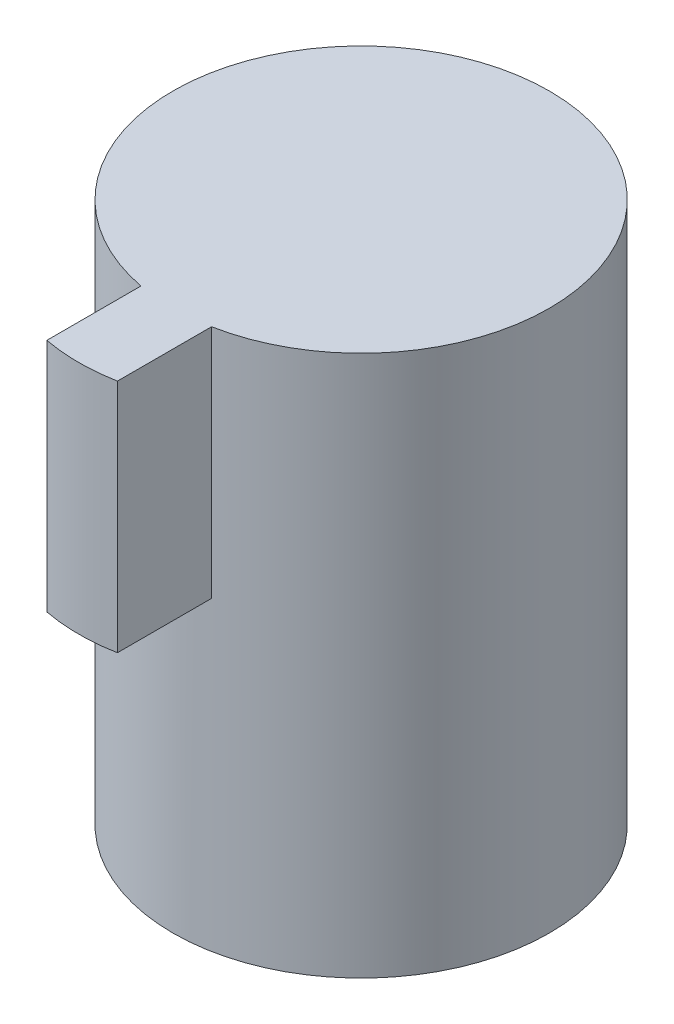
ISO-10303-21;
HEADER;
FILE_DESCRIPTION(('STEP AP214'),'2;1');
FILE_NAME('part.step','',(''),(''),'','','');
FILE_SCHEMA(('AUTOMOTIVE_DESIGN { 1 0 10303 214 1 1 1 1 }'));
ENDSEC;
DATA;
#1=APPLICATION_CONTEXT('core data for automotive mechanical design processes');
#2=APPLICATION_PROTOCOL_DEFINITION('international standard','automotive_design',2000,#1);
#3=PRODUCT_CONTEXT('',#1,'mechanical');
#4=PRODUCT('Part','Part','',(#3));
#5=PRODUCT_RELATED_PRODUCT_CATEGORY('part','',(#4));
#6=PRODUCT_DEFINITION_FORMATION('','',#4);
#7=PRODUCT_DEFINITION_CONTEXT('part definition',#1,'design');
#8=PRODUCT_DEFINITION('design','',#6,#7);
#9=PRODUCT_DEFINITION_SHAPE('','',#8);
#10=(LENGTH_UNIT() NAMED_UNIT(*) SI_UNIT(.MILLI.,.METRE.));
#11=(NAMED_UNIT(*) PLANE_ANGLE_UNIT() SI_UNIT($,.RADIAN.));
#12=(NAMED_UNIT(*) SI_UNIT($,.STERADIAN.) SOLID_ANGLE_UNIT());
#13=UNCERTAINTY_MEASURE_WITH_UNIT(LENGTH_MEASURE(1.E-05),#10,'distance_accuracy_value','');
#14=(GEOMETRIC_REPRESENTATION_CONTEXT(3) GLOBAL_UNCERTAINTY_ASSIGNED_CONTEXT((#13)) GLOBAL_UNIT_ASSIGNED_CONTEXT((#10,
#11,#12)) REPRESENTATION_CONTEXT('',''));
#15=CARTESIAN_POINT('',(0.,0.,0.));
#16=DIRECTION('',(0.,0.,1.));
#17=DIRECTION('',(1.,0.,0.));
#18=AXIS2_PLACEMENT_3D('',#15,#16,#17);
#19=CARTESIAN_POINT('',(0.,11.5,0.));
#20=DIRECTION('',(0.,1.,0.));
#21=DIRECTION('',(-1.,0.,0.));
#22=AXIS2_PLACEMENT_3D('',#19,#20,#21);
#23=PLANE('',#22);
#24=CARTESIAN_POINT('',(0.,11.5,0.));
#25=DIRECTION('',(0.,-1.,0.));
#26=DIRECTION('',(1.,0.,0.));
#27=AXIS2_PLACEMENT_3D('',#24,#25,#26);
#28=CIRCLE('',#27,4.);
#29=CARTESIAN_POINT('',(-0.750000000000001,11.5,3.92905841137543));
#30=VERTEX_POINT('',#29);
#31=CARTESIAN_POINT('',(0.749999999999999,11.5,3.92905841137543));
#32=VERTEX_POINT('',#31);
#33=EDGE_CURVE('E11',#30,#32,#28,.T.);
#34=ORIENTED_EDGE('',*,*,#33,.F.);
#35=DIRECTION('',(0.,0.,1.));
#36=VECTOR('',#35,1.);
#37=CARTESIAN_POINT('',(-0.750000000000001,11.5,3.92905841137543));
#38=LINE('',#37,#36);
#39=CARTESIAN_POINT('',(-0.750000000000001,11.5,5.92905841137543));
#40=VERTEX_POINT('',#39);
#41=EDGE_CURVE('E62',#30,#40,#38,.T.);
#42=ORIENTED_EDGE('',*,*,#41,.T.);
#43=CARTESIAN_POINT('',(0.,11.5,2.));
#44=DIRECTION('',(0.,-1.,0.));
#45=DIRECTION('',(0.,0.,-1.));
#46=AXIS2_PLACEMENT_3D('',#43,#44,#45);
#47=CIRCLE('',#46,4.);
#48=CARTESIAN_POINT('',(0.749999999999999,11.5,5.92905841137543));
#49=VERTEX_POINT('',#48);
#50=EDGE_CURVE('E80',#49,#40,#47,.T.);
#51=ORIENTED_EDGE('',*,*,#50,.F.);
#52=DIRECTION('',(0.,0.,1.));
#53=VECTOR('',#52,1.);
#54=CARTESIAN_POINT('',(0.75,11.5,3.92905841137543));
#55=LINE('',#54,#53);
#56=EDGE_CURVE('E85',#32,#49,#55,.T.);
#57=ORIENTED_EDGE('',*,*,#56,.F.);
#58=EDGE_LOOP('',(#34,#42,#51,#57));
#59=FACE_BOUND('',#58,.T.);
#60=ADVANCED_FACE('F39',(#59),#23,.T.);
#61=CARTESIAN_POINT('',(0.,0.,0.));
#62=DIRECTION('',(0.,-1.,0.));
#63=DIRECTION('',(1.,0.,0.));
#64=AXIS2_PLACEMENT_3D('',#61,#62,#63);
#65=CYLINDRICAL_SURFACE('',#64,4.);
#66=DIRECTION('',(0.,-1.,0.));
#67=VECTOR('',#66,1.);
#68=CARTESIAN_POINT('',(-0.750000000000001,0.,3.92905841137543));
#69=LINE('',#68,#67);
#70=CARTESIAN_POINT('',(-0.750000000000001,6.5,3.92905841137543));
#71=VERTEX_POINT('',#70);
#72=EDGE_CURVE('E100',#30,#71,#69,.T.);
#73=ORIENTED_EDGE('',*,*,#72,.F.);
#74=ORIENTED_EDGE('',*,*,#33,.T.);
#75=DIRECTION('',(0.,-1.,0.));
#76=VECTOR('',#75,1.);
#77=CARTESIAN_POINT('',(0.75,0.,3.92905841137543));
#78=LINE('',#77,#76);
#79=CARTESIAN_POINT('',(0.75,6.5,3.92905841137543));
#80=VERTEX_POINT('',#79);
#81=EDGE_CURVE('E91',#32,#80,#78,.T.);
#82=ORIENTED_EDGE('',*,*,#81,.T.);
#83=CARTESIAN_POINT('',(0.,6.5,0.));
#84=DIRECTION('',(0.,1.,0.));
#85=DIRECTION('',(0.,0.,1.));
#86=AXIS2_PLACEMENT_3D('',#83,#84,#85);
#87=CIRCLE('',#86,4.);
#88=EDGE_CURVE('E53',#71,#80,#87,.T.);
#89=ORIENTED_EDGE('',*,*,#88,.F.);
#90=EDGE_LOOP('',(#73,#74,#82,#89));
#91=FACE_BOUND('',#90,.T.);
#92=CARTESIAN_POINT('',(0.,0.,0.));
#93=DIRECTION('',(0.,-1.,0.));
#94=DIRECTION('',(1.,0.,0.));
#95=AXIS2_PLACEMENT_3D('',#92,#93,#94);
#96=CIRCLE('',#95,4.);
#97=CARTESIAN_POINT('',(4.,0.,0.));
#98=VERTEX_POINT('',#97);
#99=EDGE_CURVE('E46',#98,#98,#96,.T.);
#100=ORIENTED_EDGE('',*,*,#99,.F.);
#101=EDGE_LOOP('',(#100));
#102=FACE_BOUND('',#101,.T.);
#103=ADVANCED_FACE('F98',(#91,#102),#65,.T.);
#104=CARTESIAN_POINT('',(4.,0.,0.));
#105=DIRECTION('',(0.,-1.,0.));
#106=DIRECTION('',(1.,0.,0.));
#107=AXIS2_PLACEMENT_3D('',#104,#105,#106);
#108=PLANE('',#107);
#109=ORIENTED_EDGE('',*,*,#99,.T.);
#110=EDGE_LOOP('',(#109));
#111=FACE_BOUND('',#110,.T.);
#112=CARTESIAN_POINT('',(0.,0.,0.));
#113=DIRECTION('',(0.,-1.,0.));
#114=DIRECTION('',(1.,0.,0.));
#115=AXIS2_PLACEMENT_3D('',#112,#113,#114);
#116=CIRCLE('',#115,2.5);
#117=CARTESIAN_POINT('',(2.5,0.,0.));
#118=VERTEX_POINT('',#117);
#119=EDGE_CURVE('E117',#118,#118,#116,.T.);
#120=ORIENTED_EDGE('',*,*,#119,.F.);
#121=EDGE_LOOP('',(#120));
#122=FACE_BOUND('',#121,.T.);
#123=ADVANCED_FACE('F122',(#111,#122),#108,.T.);
#124=CARTESIAN_POINT('',(0.,0.,0.));
#125=DIRECTION('',(0.,-1.,0.));
#126=DIRECTION('',(1.,0.,0.));
#127=AXIS2_PLACEMENT_3D('',#124,#125,#126);
#128=CYLINDRICAL_SURFACE('',#127,2.5);
#129=ORIENTED_EDGE('',*,*,#119,.T.);
#130=EDGE_LOOP('',(#129));
#131=FACE_BOUND('',#130,.T.);
#132=CARTESIAN_POINT('',(0.,10.,0.));
#133=DIRECTION('',(0.,-1.,0.));
#134=DIRECTION('',(1.,0.,0.));
#135=AXIS2_PLACEMENT_3D('',#132,#133,#134);
#136=CIRCLE('',#135,2.5);
#137=CARTESIAN_POINT('',(2.5,10.,0.));
#138=VERTEX_POINT('',#137);
#139=EDGE_CURVE('E95',#138,#138,#136,.T.);
#140=ORIENTED_EDGE('',*,*,#139,.F.);
#141=EDGE_LOOP('',(#140));
#142=FACE_BOUND('',#141,.T.);
#143=ADVANCED_FACE('F130',(#131,#142),#128,.F.);
#144=CARTESIAN_POINT('',(2.5,10.,0.));
#145=DIRECTION('',(0.,-1.,0.));
#146=DIRECTION('',(1.,0.,0.));
#147=AXIS2_PLACEMENT_3D('',#144,#145,#146);
#148=PLANE('',#147);
#149=ORIENTED_EDGE('',*,*,#139,.T.);
#150=EDGE_LOOP('',(#149));
#151=FACE_BOUND('',#150,.T.);
#152=ADVANCED_FACE('F135',(#151),#148,.T.);
#153=CARTESIAN_POINT('',(0.,0.,2.));
#154=DIRECTION('',(0.,-1.,0.));
#155=DIRECTION('',(1.,0.,0.));
#156=AXIS2_PLACEMENT_3D('',#153,#154,#155);
#157=CYLINDRICAL_SURFACE('',#156,4.);
#158=DIRECTION('',(0.,-1.,0.));
#159=VECTOR('',#158,1.);
#160=CARTESIAN_POINT('',(0.75,0.,5.92905841137543));
#161=LINE('',#160,#159);
#162=CARTESIAN_POINT('',(0.75,6.5,5.92905841137543));
#163=VERTEX_POINT('',#162);
#164=EDGE_CURVE('E96',#49,#163,#161,.T.);
#165=ORIENTED_EDGE('',*,*,#164,.F.);
#166=ORIENTED_EDGE('',*,*,#50,.T.);
#167=DIRECTION('',(0.,-1.,0.));
#168=VECTOR('',#167,1.);
#169=CARTESIAN_POINT('',(-0.750000000000001,0.,5.92905841137543));
#170=LINE('',#169,#168);
#171=CARTESIAN_POINT('',(-0.750000000000001,6.5,5.92905841137543));
#172=VERTEX_POINT('',#171);
#173=EDGE_CURVE('E103',#40,#172,#170,.T.);
#174=ORIENTED_EDGE('',*,*,#173,.T.);
#175=CARTESIAN_POINT('',(0.,6.5,2.));
#176=DIRECTION('',(0.,1.,0.));
#177=DIRECTION('',(0.,0.,1.));
#178=AXIS2_PLACEMENT_3D('',#175,#176,#177);
#179=CIRCLE('',#178,4.);
#180=EDGE_CURVE('E105',#172,#163,#179,.T.);
#181=ORIENTED_EDGE('',*,*,#180,.T.);
#182=EDGE_LOOP('',(#165,#166,#174,#181));
#183=FACE_BOUND('',#182,.T.);
#184=ADVANCED_FACE('F139',(#183),#157,.T.);
#185=CARTESIAN_POINT('',(-0.750000000000001,0.,3.92905841137543));
#186=DIRECTION('',(-1.,0.,0.));
#187=DIRECTION('',(0.,-1.,0.));
#188=AXIS2_PLACEMENT_3D('',#185,#186,#187);
#189=PLANE('',#188);
#190=ORIENTED_EDGE('',*,*,#173,.F.);
#191=ORIENTED_EDGE('',*,*,#41,.F.);
#192=ORIENTED_EDGE('',*,*,#72,.T.);
#193=DIRECTION('',(0.,0.,1.));
#194=VECTOR('',#193,1.);
#195=CARTESIAN_POINT('',(-0.750000000000001,6.5,3.92905841137543));
#196=LINE('',#195,#194);
#197=EDGE_CURVE('E102',#71,#172,#196,.T.);
#198=ORIENTED_EDGE('',*,*,#197,.T.);
#199=EDGE_LOOP('',(#190,#191,#192,#198));
#200=FACE_BOUND('',#199,.T.);
#201=ADVANCED_FACE('F142',(#200),#189,.T.);
#202=CARTESIAN_POINT('',(0.75,6.5,3.92905841137543));
#203=DIRECTION('',(0.,-1.,0.));
#204=DIRECTION('',(0.,0.,-1.));
#205=AXIS2_PLACEMENT_3D('',#202,#203,#204);
#206=PLANE('',#205);
#207=ORIENTED_EDGE('',*,*,#180,.F.);
#208=ORIENTED_EDGE('',*,*,#197,.F.);
#209=ORIENTED_EDGE('',*,*,#88,.T.);
#210=DIRECTION('',(0.,0.,1.));
#211=VECTOR('',#210,1.);
#212=CARTESIAN_POINT('',(0.75,6.5,3.92905841137543));
#213=LINE('',#212,#211);
#214=EDGE_CURVE('E93',#80,#163,#213,.T.);
#215=ORIENTED_EDGE('',*,*,#214,.T.);
#216=EDGE_LOOP('',(#207,#208,#209,#215));
#217=FACE_BOUND('',#216,.T.);
#218=ADVANCED_FACE('F145',(#217),#206,.T.);
#219=CARTESIAN_POINT('',(0.75,0.,3.92905841137543));
#220=DIRECTION('',(-1.,0.,0.));
#221=DIRECTION('',(0.,-1.,0.));
#222=AXIS2_PLACEMENT_3D('',#219,#220,#221);
#223=PLANE('',#222);
#224=ORIENTED_EDGE('',*,*,#164,.T.);
#225=ORIENTED_EDGE('',*,*,#214,.F.);
#226=ORIENTED_EDGE('',*,*,#81,.F.);
#227=ORIENTED_EDGE('',*,*,#56,.T.);
#228=EDGE_LOOP('',(#224,#225,#226,#227));
#229=FACE_BOUND('',#228,.T.);
#230=ADVANCED_FACE('F92',(#229),#223,.F.);
#231=CLOSED_SHELL('',(#60,#103,#123,#143,#152,#184,#201,#218,#230));
#232=MANIFOLD_SOLID_BREP('B2',#231);
#233=ADVANCED_BREP_SHAPE_REPRESENTATION('',(#18,#232),#14);
#234=SHAPE_DEFINITION_REPRESENTATION(#9,#233);
ENDSEC;
END-ISO-10303-21;
